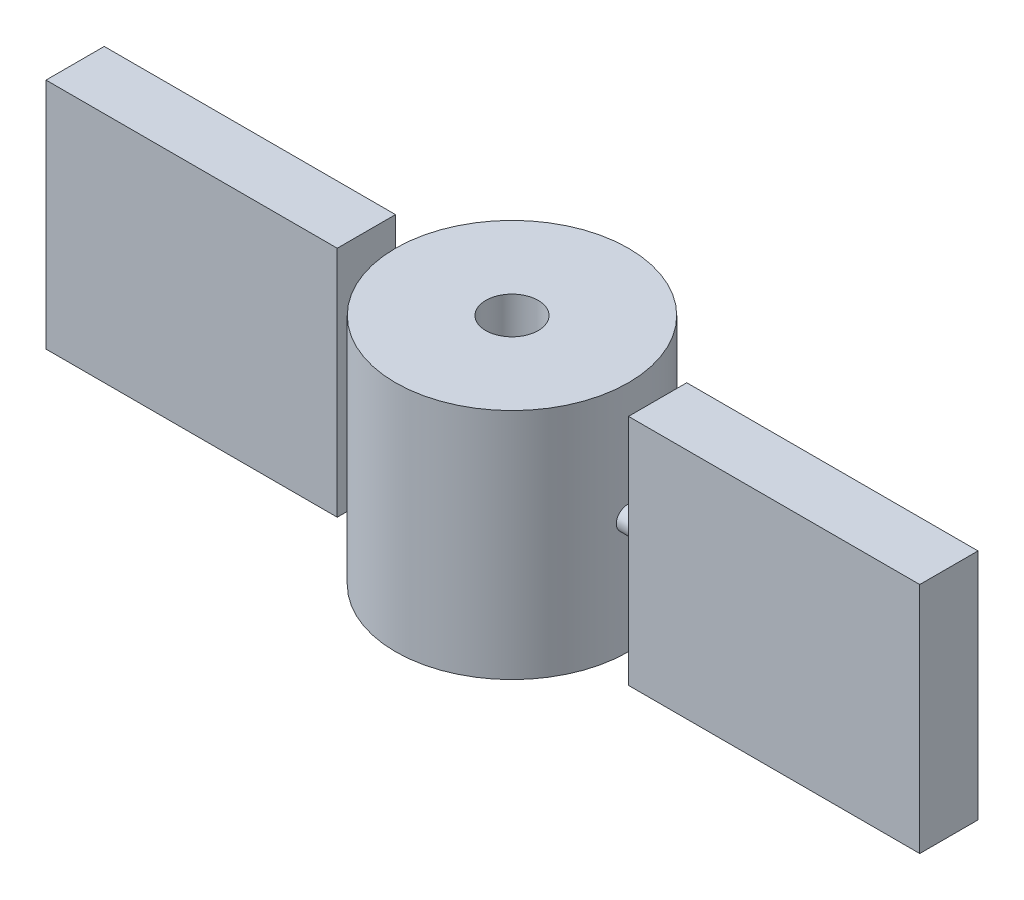
ISO-10303-21;
HEADER;
FILE_DESCRIPTION(('STEP AP214'),'2;1');
FILE_NAME('part.step','',(''),(''),'','','');
FILE_SCHEMA(('AUTOMOTIVE_DESIGN { 1 0 10303 214 1 1 1 1 }'));
ENDSEC;
DATA;
#1=APPLICATION_CONTEXT('core data for automotive mechanical design processes');
#2=APPLICATION_PROTOCOL_DEFINITION('international standard','automotive_design',2000,#1);
#3=PRODUCT_CONTEXT('',#1,'mechanical');
#4=PRODUCT('Part','Part','',(#3));
#5=PRODUCT_RELATED_PRODUCT_CATEGORY('part','',(#4));
#6=PRODUCT_DEFINITION_FORMATION('','',#4);
#7=PRODUCT_DEFINITION_CONTEXT('part definition',#1,'design');
#8=PRODUCT_DEFINITION('design','',#6,#7);
#9=PRODUCT_DEFINITION_SHAPE('','',#8);
#10=(LENGTH_UNIT() NAMED_UNIT(*) SI_UNIT(.MILLI.,.METRE.));
#11=(NAMED_UNIT(*) PLANE_ANGLE_UNIT() SI_UNIT($,.RADIAN.));
#12=(NAMED_UNIT(*) SI_UNIT($,.STERADIAN.) SOLID_ANGLE_UNIT());
#13=UNCERTAINTY_MEASURE_WITH_UNIT(LENGTH_MEASURE(1.E-05),#10,'distance_accuracy_value','');
#14=(GEOMETRIC_REPRESENTATION_CONTEXT(3) GLOBAL_UNCERTAINTY_ASSIGNED_CONTEXT((#13)) GLOBAL_UNIT_ASSIGNED_CONTEXT((#10,
#11,#12)) REPRESENTATION_CONTEXT('',''));
#15=CARTESIAN_POINT('',(0.,0.,0.));
#16=DIRECTION('',(0.,0.,1.));
#17=DIRECTION('',(1.,0.,0.));
#18=AXIS2_PLACEMENT_3D('',#15,#16,#17);
#19=CARTESIAN_POINT('',(50.,20.,0.));
#20=DIRECTION('',(-1.,0.,0.));
#21=DIRECTION('',(0.,0.,1.));
#22=AXIS2_PLACEMENT_3D('',#19,#20,#21);
#23=CYLINDRICAL_SURFACE('',#22,2.);
#24=CARTESIAN_POINT('',(19.8997487421324,20.,1.99999999999999));
#25=CARTESIAN_POINT('',(19.8997500559381,19.8879608716528,1.99999514678702));
#26=CARTESIAN_POINT('',(19.9007051398844,19.7758476631763,1.99055371796494));
#27=CARTESIAN_POINT('',(19.9044217511624,19.5547296274129,1.95303262952712));
#28=CARTESIAN_POINT('',(19.9071852692244,19.445728363925,1.92493242977286));
#29=CARTESIAN_POINT('',(19.9142026609477,19.2340683615642,1.85092023213785));
#30=CARTESIAN_POINT('',(19.9184556309358,19.1314058212171,1.80501903258779));
#31=CARTESIAN_POINT('',(19.9279716114364,18.9352644154165,1.69672853478219));
#32=CARTESIAN_POINT('',(19.9332344212866,18.8417837310325,1.63434251125185));
#33=CARTESIAN_POINT('',(19.944198534198,18.666297472685,1.4946095239974));
#34=CARTESIAN_POINT('',(19.9499012001053,18.5843299809924,1.41721483621652));
#35=CARTESIAN_POINT('',(19.9610901047144,18.4345247819929,1.24976343063912));
#36=CARTESIAN_POINT('',(19.9665763335043,18.3666877211874,1.15970613381313));
#37=CARTESIAN_POINT('',(19.9767276631121,18.2469374859857,0.96925272330197));
#38=CARTESIAN_POINT('',(19.9813910178929,18.1950580024127,0.868835325059134));
#39=CARTESIAN_POINT('',(19.9893563375154,18.1089111337026,0.660659968575017));
#40=CARTESIAN_POINT('',(19.9926583355413,18.074643319261,0.552902189336433));
#41=CARTESIAN_POINT('',(19.9975193314205,18.0248041812935,0.333489565485894));
#42=CARTESIAN_POINT('',(19.9990841568563,18.0091703345001,0.221849054063158));
#43=CARTESIAN_POINT('',(20.0003143119738,17.9968494617326,-0.00248148137789152));
#44=CARTESIAN_POINT('',(19.9999796909055,18.0001619445074,-0.115171478108928));
#45=CARTESIAN_POINT('',(19.9974534262237,18.0255889453003,-0.337977688129126));
#46=CARTESIAN_POINT('',(19.9952684230343,18.0476362311278,-0.448101659869964));
#47=CARTESIAN_POINT('',(19.9892945852986,18.1098022578932,-0.663078359009072));
#48=CARTESIAN_POINT('',(19.9855057299191,18.1499212335751,-0.767931017915463));
#49=CARTESIAN_POINT('',(19.9767387496783,18.2471655265089,-0.969600629359178));
#50=CARTESIAN_POINT('',(19.9717585473152,18.3043205950603,-1.0664031419633));
#51=CARTESIAN_POINT('',(19.9611676903881,18.4339930466727,-1.24906702634839));
#52=CARTESIAN_POINT('',(19.9555570173362,18.5065108802904,-1.33492807712166));
#53=CARTESIAN_POINT('',(19.944305869357,18.6652284590273,-1.49366554364538));
#54=CARTESIAN_POINT('',(19.9386653714606,18.7514866894831,-1.5664834923807));
#55=CARTESIAN_POINT('',(19.9280147985644,18.9350337304215,-1.69661507071584));
#56=CARTESIAN_POINT('',(19.9230047244793,19.0323225569043,-1.75392867782579));
#57=CARTESIAN_POINT('',(19.914181790283,19.2352140503996,-1.85142436914647));
#58=CARTESIAN_POINT('',(19.9103691826511,19.3408184648458,-1.89160284114593));
#59=CARTESIAN_POINT('',(19.9043780374188,19.5573212092294,-1.95364147127519));
#60=CARTESIAN_POINT('',(19.9021994500354,19.6682193777749,-1.97550218748607));
#61=CARTESIAN_POINT('',(19.8997316105483,19.891648359059,-2.00020955078393));
#62=CARTESIAN_POINT('',(19.8994342309521,20.0041700405297,-2.00313799329443));
#63=CARTESIAN_POINT('',(19.9007410270954,20.2281025316457,-1.99011249374273));
#64=CARTESIAN_POINT('',(19.9023451771412,20.3395133562807,-1.97415880681951));
#65=CARTESIAN_POINT('',(19.907266888448,20.5578231645567,-1.92389034901505));
#66=CARTESIAN_POINT('',(19.9105808400269,20.6647311421893,-1.88961425437782));
#67=CARTESIAN_POINT('',(19.9185458207759,20.8712801034606,-1.80371343935189));
#68=CARTESIAN_POINT('',(19.9231968805734,20.9709209205744,-1.75208832156718));
#69=CARTESIAN_POINT('',(19.9333316871143,21.1604799480575,-1.63275000284644));
#70=CARTESIAN_POINT('',(19.9388182162934,21.2503638839325,-1.56498259968139));
#71=CARTESIAN_POINT('',(19.9499966525037,21.4175101065481,-1.41536106690235));
#72=CARTESIAN_POINT('',(19.9556885646173,21.4947720806801,-1.33350658849627));
#73=CARTESIAN_POINT('',(19.966660956986,21.6347632667962,-1.15767960845295));
#74=CARTESIAN_POINT('',(19.9719398811095,21.6974391191724,-1.06366451193891));
#75=CARTESIAN_POINT('',(19.9814688421326,21.8061117370128,-0.866395434834269));
#76=CARTESIAN_POINT('',(19.9857188931298,21.8521087310142,-0.763141580859258));
#77=CARTESIAN_POINT('',(19.9927042082801,21.9260275353107,-0.550512252865638));
#78=CARTESIAN_POINT('',(19.995442172113,21.9539815746504,-0.441148075299926));
#79=CARTESIAN_POINT('',(19.999105892273,21.9911261391597,-0.219249627967365));
#80=CARTESIAN_POINT('',(20.0000316995313,22.0003171916681,-0.106715447384442));
#81=CARTESIAN_POINT('',(19.9999667662654,21.9996674671201,0.117804448151486));
#82=CARTESIAN_POINT('',(19.9989843675334,21.9899095263267,0.229790414449048));
#83=CARTESIAN_POINT('',(19.9952298715518,21.951812508686,0.450523776712718));
#84=CARTESIAN_POINT('',(19.9924577728975,21.9234734172541,0.559271170136724));
#85=CARTESIAN_POINT('',(19.9854344762792,21.8490414852141,0.77043981753548));
#86=CARTESIAN_POINT('',(19.981183480065,21.8029510661317,0.87286193215505));
#87=CARTESIAN_POINT('',(19.9716762483259,21.694333662166,1.06852920030958));
#88=CARTESIAN_POINT('',(19.9664200186831,21.6318067734578,1.16177440753711));
#89=CARTESIAN_POINT('',(19.9554636933811,21.4917807619525,1.33686544885387));
#90=CARTESIAN_POINT('',(19.949761829214,21.4142199675104,1.41866185243867));
#91=CARTESIAN_POINT('',(19.9385718153932,21.2464492969091,1.56811551878628));
#92=CARTESIAN_POINT('',(19.9330837173555,21.1562363896618,1.63576938369569));
#93=CARTESIAN_POINT('',(19.922927668212,20.9654713161602,1.7551532808481));
#94=CARTESIAN_POINT('',(19.9182618385061,20.8648934373519,1.80684237598966));
#95=CARTESIAN_POINT('',(19.9103038952492,20.6565034175075,1.89252941619753));
#96=CARTESIAN_POINT('',(19.9070102330672,20.5486995921486,1.92654731577971));
#97=CARTESIAN_POINT('',(19.9030001507629,20.3669045182018,1.96744337666705));
#98=CARTESIAN_POINT('',(19.9017866387139,20.2940754973871,1.97963542479644));
#99=CARTESIAN_POINT('',(19.9001605035533,20.1475083539149,1.99591531721022));
#100=CARTESIAN_POINT('',(19.8997478770797,20.0737702350748,2.00000319551452));
#101=CARTESIAN_POINT('',(19.8997487421324,20.,1.99999999999999));
#102=B_SPLINE_CURVE_WITH_KNOTS('',3,(#24,#25,#26,#27,#28,#29,#30,#31,#32,#33,#34,#35,#36,#37,
#38,#39,#40,#41,#42,#43,#44,#45,#46,#47,#48,#49,#50,#51,#52,#53,#54,#55,#56,#57,#58,#59,#60,#61,
#62,#63,#64,#65,#66,#67,#68,#69,#70,#71,#72,#73,#74,#75,#76,#77,#78,#79,#80,#81,#82,#83,#84,#85,
#86,#87,#88,#89,#90,#91,#92,#93,#94,#95,#96,#97,#98,#99,#100,#101),.UNSPECIFIED.,.T.,.F.,(4,2,2,
2,2,2,2,2,2,2,2,2,2,2,2,2,2,2,2,2,2,2,2,2,2,2,2,2,2,2,2,2,2,2,2,2,2,2,4),(0.,0.335847988872923,
0.672066303643539,1.00808098199495,1.34402896084263,1.6810632305985,2.01811291710506,
2.35586939942583,2.69361764815589,3.03022941796899,3.36683245996465,3.70223263637323,
4.03763716961949,4.37363090932827,4.70963450437058,5.04710850170003,5.38458298855126,
5.72212858235868,6.05966389190066,6.3957399261553,6.7318114193374,7.06717629409054,
7.40254885122095,7.73906379623436,8.07558707446405,8.41332273636237,8.7510537703601,
9.08817985388722,9.42529646226299,9.76094266936966,10.0965891399332,10.4321898399049,
10.767788576216,11.1047943007598,11.4418809006905,11.7798248214095,12.11738629788,
12.3385205521209,12.5596538780763),.UNSPECIFIED.);
#103=CARTESIAN_POINT('',(19.8997487421324,20.,1.99999999999999));
#104=VERTEX_POINT('',#103);
#105=EDGE_CURVE('E52',#104,#104,#102,.T.);
#106=ORIENTED_EDGE('',*,*,#105,.T.);
#107=EDGE_LOOP('',(#106));
#108=FACE_BOUND('',#107,.T.);
#109=CARTESIAN_POINT('',(25.,20.,0.));
#110=DIRECTION('',(1.,0.,0.));
#111=DIRECTION('',(0.,0.,-1.));
#112=AXIS2_PLACEMENT_3D('',#109,#110,#111);
#113=CIRCLE('',#112,2.);
#114=CARTESIAN_POINT('',(25.,20.,-2.00000000000001));
#115=VERTEX_POINT('',#114);
#116=EDGE_CURVE('E11',#115,#115,#113,.T.);
#117=ORIENTED_EDGE('',*,*,#116,.F.);
#118=EDGE_LOOP('',(#117));
#119=FACE_BOUND('',#118,.T.);
#120=ADVANCED_FACE('F41',(#108,#119),#23,.T.);
#121=CARTESIAN_POINT('',(0.,40.,0.));
#122=DIRECTION('',(0.,-1.,0.));
#123=DIRECTION('',(0.,0.,-1.));
#124=AXIS2_PLACEMENT_3D('',#121,#122,#123);
#125=CYLINDRICAL_SURFACE('',#124,20.);
#126=CARTESIAN_POINT('',(0.,40.,0.));
#127=DIRECTION('',(0.,1.,0.));
#128=DIRECTION('',(0.,0.,1.));
#129=AXIS2_PLACEMENT_3D('',#126,#127,#128);
#130=CIRCLE('',#129,20.);
#131=CARTESIAN_POINT('',(0.,40.,20.));
#132=VERTEX_POINT('',#131);
#133=EDGE_CURVE('E183',#132,#132,#130,.T.);
#134=ORIENTED_EDGE('',*,*,#133,.F.);
#135=EDGE_LOOP('',(#134));
#136=FACE_BOUND('',#135,.T.);
#137=CARTESIAN_POINT('',(0.,0.,0.));
#138=DIRECTION('',(0.,1.,0.));
#139=DIRECTION('',(0.,0.,1.));
#140=AXIS2_PLACEMENT_3D('',#137,#138,#139);
#141=CIRCLE('',#140,20.);
#142=CARTESIAN_POINT('',(0.,0.,20.));
#143=VERTEX_POINT('',#142);
#144=EDGE_CURVE('E187',#143,#143,#141,.T.);
#145=ORIENTED_EDGE('',*,*,#144,.T.);
#146=EDGE_LOOP('',(#145));
#147=FACE_BOUND('',#146,.T.);
#148=CARTESIAN_POINT('',(-19.8997487421324,20.,1.99999999999999));
#149=CARTESIAN_POINT('',(-19.8997500559381,20.1120391283472,1.99999514678702));
#150=CARTESIAN_POINT('',(-19.9007051398844,20.2241523368237,1.99055371796494));
#151=CARTESIAN_POINT('',(-19.9044217511624,20.4452703725871,1.95303262952712));
#152=CARTESIAN_POINT('',(-19.9071852692244,20.554271636075,1.92493242977287));
#153=CARTESIAN_POINT('',(-19.9142026609477,20.7659316384358,1.85092023213785));
#154=CARTESIAN_POINT('',(-19.9184556309358,20.8685941787829,1.80501903258779));
#155=CARTESIAN_POINT('',(-19.9279716114364,21.0647355845835,1.6967285347822));
#156=CARTESIAN_POINT('',(-19.9332344212866,21.1582162689674,1.63434251125185));
#157=CARTESIAN_POINT('',(-19.944198534198,21.333702527315,1.4946095239974));
#158=CARTESIAN_POINT('',(-19.9499012001053,21.4156700190075,1.41721483621652));
#159=CARTESIAN_POINT('',(-19.9610901047144,21.5654752180071,1.24976343063912));
#160=CARTESIAN_POINT('',(-19.9665763335043,21.6333122788126,1.15970613381313));
#161=CARTESIAN_POINT('',(-19.9767276631121,21.7530625140143,0.96925272330197));
#162=CARTESIAN_POINT('',(-19.9813910178929,21.8049419975873,0.868835325059134));
#163=CARTESIAN_POINT('',(-19.9893563375154,21.8910888662974,0.660659968575017));
#164=CARTESIAN_POINT('',(-19.9926583355413,21.9253566807389,0.552902189336433));
#165=CARTESIAN_POINT('',(-19.9975193314205,21.9751958187065,0.333489565485894));
#166=CARTESIAN_POINT('',(-19.9990841568563,21.9908296654999,0.221849054063158));
#167=CARTESIAN_POINT('',(-20.0003143119738,22.0031505382674,-0.00248148137789152));
#168=CARTESIAN_POINT('',(-19.9999796909055,21.9998380554925,-0.115171478108928));
#169=CARTESIAN_POINT('',(-19.9974534262237,21.9744110546997,-0.337977688129126));
#170=CARTESIAN_POINT('',(-19.9952684230343,21.9523637688722,-0.448101659869964));
#171=CARTESIAN_POINT('',(-19.9892945852986,21.8901977421067,-0.663078359009072));
#172=CARTESIAN_POINT('',(-19.9855057299191,21.8500787664248,-0.767931017915463));
#173=CARTESIAN_POINT('',(-19.9767387496783,21.7528344734911,-0.969600629359178));
#174=CARTESIAN_POINT('',(-19.9717585473152,21.6956794049397,-1.0664031419633));
#175=CARTESIAN_POINT('',(-19.9611676903881,21.5660069533272,-1.24906702634839));
#176=CARTESIAN_POINT('',(-19.9555570173362,21.4934891197096,-1.33492807712166));
#177=CARTESIAN_POINT('',(-19.944305869357,21.3347715409727,-1.49366554364538));
#178=CARTESIAN_POINT('',(-19.9386653714606,21.2485133105168,-1.5664834923807));
#179=CARTESIAN_POINT('',(-19.9280147985644,21.0649662695784,-1.69661507071584));
#180=CARTESIAN_POINT('',(-19.9230047244793,20.9676774430957,-1.75392867782579));
#181=CARTESIAN_POINT('',(-19.914181790283,20.7647859496004,-1.85142436914647));
#182=CARTESIAN_POINT('',(-19.9103691826511,20.6591815351542,-1.89160284114593));
#183=CARTESIAN_POINT('',(-19.9043780374188,20.4426787907706,-1.95364147127518));
#184=CARTESIAN_POINT('',(-19.9021994500354,20.3317806222251,-1.97550218748607));
#185=CARTESIAN_POINT('',(-19.8997316105483,20.108351640941,-2.00020955078393));
#186=CARTESIAN_POINT('',(-19.8994342309521,19.9958299594703,-2.00313799329443));
#187=CARTESIAN_POINT('',(-19.9007410270954,19.7718974683543,-1.99011249374273));
#188=CARTESIAN_POINT('',(-19.9023451771412,19.6604866437193,-1.97415880681951));
#189=CARTESIAN_POINT('',(-19.907266888448,19.4421768354433,-1.92389034901505));
#190=CARTESIAN_POINT('',(-19.9105808400269,19.3352688578107,-1.88961425437782));
#191=CARTESIAN_POINT('',(-19.9185458207759,19.1287198965394,-1.80371343935189));
#192=CARTESIAN_POINT('',(-19.9231968805734,19.0290790794256,-1.75208832156718));
#193=CARTESIAN_POINT('',(-19.9333316871143,18.8395200519424,-1.63275000284644));
#194=CARTESIAN_POINT('',(-19.9388182162934,18.7496361160675,-1.56498259968139));
#195=CARTESIAN_POINT('',(-19.9499966525037,18.5824898934519,-1.41536106690235));
#196=CARTESIAN_POINT('',(-19.9556885646173,18.5052279193198,-1.33350658849627));
#197=CARTESIAN_POINT('',(-19.966660956986,18.3652367332038,-1.15767960845295));
#198=CARTESIAN_POINT('',(-19.9719398811095,18.3025608808275,-1.06366451193891));
#199=CARTESIAN_POINT('',(-19.9814688421326,18.1938882629872,-0.866395434834272));
#200=CARTESIAN_POINT('',(-19.9857188931298,18.1478912689858,-0.76314158085926));
#201=CARTESIAN_POINT('',(-19.9927042082801,18.0739724646893,-0.550512252865637));
#202=CARTESIAN_POINT('',(-19.995442172113,18.0460184253496,-0.441148075299926));
#203=CARTESIAN_POINT('',(-19.999105892273,18.0088738608403,-0.219249627967365));
#204=CARTESIAN_POINT('',(-20.0000316995313,17.9996828083319,-0.106715447384442));
#205=CARTESIAN_POINT('',(-19.9999667662654,18.0003325328799,0.117804448151487));
#206=CARTESIAN_POINT('',(-19.9989843675334,18.0100904736733,0.229790414449049));
#207=CARTESIAN_POINT('',(-19.9952298715518,18.0481874913139,0.450523776712719));
#208=CARTESIAN_POINT('',(-19.9924577728975,18.0765265827459,0.559271170136725));
#209=CARTESIAN_POINT('',(-19.9854344762792,18.1509585147859,0.77043981753548));
#210=CARTESIAN_POINT('',(-19.981183480065,18.1970489338683,0.87286193215505));
#211=CARTESIAN_POINT('',(-19.9716762483259,18.3056663378339,1.06852920030958));
#212=CARTESIAN_POINT('',(-19.9664200186831,18.3681932265422,1.16177440753711));
#213=CARTESIAN_POINT('',(-19.9554636933811,18.5082192380475,1.33686544885387));
#214=CARTESIAN_POINT('',(-19.949761829214,18.5857800324896,1.41866185243868));
#215=CARTESIAN_POINT('',(-19.9385718153932,18.7535507030909,1.56811551878628));
#216=CARTESIAN_POINT('',(-19.9330837173555,18.8437636103381,1.63576938369569));
#217=CARTESIAN_POINT('',(-19.922927668212,19.0345286838398,1.7551532808481));
#218=CARTESIAN_POINT('',(-19.9182618385061,19.1351065626481,1.80684237598966));
#219=CARTESIAN_POINT('',(-19.9103038952492,19.3434965824925,1.89252941619753));
#220=CARTESIAN_POINT('',(-19.9070102330672,19.4513004078514,1.92654731577971));
#221=CARTESIAN_POINT('',(-19.9030001507629,19.6330954817982,1.96744337666705));
#222=CARTESIAN_POINT('',(-19.9017866387139,19.7059245026128,1.97963542479644));
#223=CARTESIAN_POINT('',(-19.9001605035533,19.8524916460851,1.99591531721022));
#224=CARTESIAN_POINT('',(-19.8997478770797,19.9262297649252,2.00000319551452));
#225=CARTESIAN_POINT('',(-19.8997487421324,20.,1.99999999999999));
#226=B_SPLINE_CURVE_WITH_KNOTS('',3,(#148,#149,#150,#151,#152,#153,#154,#155,#156,#157,#158,
#159,#160,#161,#162,#163,#164,#165,#166,#167,#168,#169,#170,#171,#172,#173,#174,#175,#176,#177,
#178,#179,#180,#181,#182,#183,#184,#185,#186,#187,#188,#189,#190,#191,#192,#193,#194,#195,#196,
#197,#198,#199,#200,#201,#202,#203,#204,#205,#206,#207,#208,#209,#210,#211,#212,#213,#214,#215,
#216,#217,#218,#219,#220,#221,#222,#223,#224,#225),.UNSPECIFIED.,.T.,.F.,(4,2,2,2,2,2,2,2,2,2,2,
2,2,2,2,2,2,2,2,2,2,2,2,2,2,2,2,2,2,2,2,2,2,2,2,2,2,2,4),(0.,0.335847988872923,
0.672066303643539,1.00808098199494,1.34402896084263,1.6810632305985,2.01811291710506,
2.35586939942583,2.69361764815589,3.03022941796899,3.36683245996465,3.70223263637323,
4.03763716961949,4.37363090932827,4.70963450437058,5.04710850170003,5.38458298855126,
5.72212858235867,6.05966389190066,6.39573992615531,6.73181141933741,7.06717629409054,
7.40254885122095,7.73906379623436,8.07558707446405,8.41332273636236,8.7510537703601,
9.08817985388723,9.42529646226299,9.76094266936967,10.0965891399332,10.4321898399049,
10.767788576216,11.1047943007598,11.4418809006905,11.7798248214095,12.11738629788,
12.3385205521209,12.5596538780763),.UNSPECIFIED.);
#227=CARTESIAN_POINT('',(-19.8997487421324,20.,1.99999999999999));
#228=VERTEX_POINT('',#227);
#229=EDGE_CURVE('E186',#228,#228,#226,.T.);
#230=ORIENTED_EDGE('',*,*,#229,.F.);
#231=EDGE_LOOP('',(#230));
#232=FACE_BOUND('',#231,.T.);
#233=ORIENTED_EDGE('',*,*,#105,.F.);
#234=EDGE_LOOP('',(#233));
#235=FACE_BOUND('',#234,.T.);
#236=ADVANCED_FACE('F43',(#136,#147,#232,#235),#125,.T.);
#237=CARTESIAN_POINT('',(0.,40.,0.));
#238=DIRECTION('',(0.,1.,0.));
#239=DIRECTION('',(0.,0.,1.));
#240=AXIS2_PLACEMENT_3D('',#237,#238,#239);
#241=PLANE('',#240);
#242=CARTESIAN_POINT('',(0.,40.,0.));
#243=DIRECTION('',(0.,1.,0.));
#244=DIRECTION('',(0.,0.,1.));
#245=AXIS2_PLACEMENT_3D('',#242,#243,#244);
#246=CIRCLE('',#245,4.5);
#247=CARTESIAN_POINT('',(0.,40.,4.5));
#248=VERTEX_POINT('',#247);
#249=EDGE_CURVE('E404',#248,#248,#246,.T.);
#250=ORIENTED_EDGE('',*,*,#249,.F.);
#251=EDGE_LOOP('',(#250));
#252=FACE_BOUND('',#251,.T.);
#253=ORIENTED_EDGE('',*,*,#133,.T.);
#254=EDGE_LOOP('',(#253));
#255=FACE_BOUND('',#254,.T.);
#256=ADVANCED_FACE('F208',(#252,#255),#241,.T.);
#257=CARTESIAN_POINT('',(0.,0.,0.));
#258=DIRECTION('',(0.,1.,0.));
#259=DIRECTION('',(0.,0.,1.));
#260=AXIS2_PLACEMENT_3D('',#257,#258,#259);
#261=PLANE('',#260);
#262=CARTESIAN_POINT('',(0.,0.,0.));
#263=DIRECTION('',(0.,1.,0.));
#264=DIRECTION('',(0.,0.,1.));
#265=AXIS2_PLACEMENT_3D('',#262,#263,#264);
#266=CIRCLE('',#265,2.15);
#267=CARTESIAN_POINT('',(0.,0.,2.15));
#268=VERTEX_POINT('',#267);
#269=EDGE_CURVE('E224',#268,#268,#266,.T.);
#270=ORIENTED_EDGE('',*,*,#269,.T.);
#271=EDGE_LOOP('',(#270));
#272=FACE_BOUND('',#271,.T.);
#273=ORIENTED_EDGE('',*,*,#144,.F.);
#274=EDGE_LOOP('',(#273));
#275=FACE_BOUND('',#274,.T.);
#276=ADVANCED_FACE('F211',(#272,#275),#261,.F.);
#277=CARTESIAN_POINT('',(-25.,20.,0.));
#278=DIRECTION('',(1.,0.,0.));
#279=DIRECTION('',(0.,1.,0.));
#280=AXIS2_PLACEMENT_3D('',#277,#278,#279);
#281=CIRCLE('',#280,2.);
#282=CARTESIAN_POINT('',(-25.,22.,0.));
#283=VERTEX_POINT('',#282);
#284=EDGE_CURVE('E182',#283,#283,#281,.T.);
#285=ORIENTED_EDGE('',*,*,#284,.T.);
#286=EDGE_LOOP('',(#285));
#287=FACE_BOUND('',#286,.T.);
#288=ORIENTED_EDGE('',*,*,#229,.T.);
#289=EDGE_LOOP('',(#288));
#290=FACE_BOUND('',#289,.T.);
#291=ADVANCED_FACE('F205',(#287,#290),#23,.T.);
#292=CARTESIAN_POINT('',(-25.,0.,5.));
#293=DIRECTION('',(1.,0.,0.));
#294=DIRECTION('',(0.,1.,0.));
#295=AXIS2_PLACEMENT_3D('',#292,#293,#294);
#296=PLANE('',#295);
#297=ORIENTED_EDGE('',*,*,#284,.F.);
#298=EDGE_LOOP('',(#297));
#299=FACE_BOUND('',#298,.T.);
#300=DIRECTION('',(0.,-1.,0.));
#301=VECTOR('',#300,1.);
#302=CARTESIAN_POINT('',(-25.,0.,-5.));
#303=LINE('',#302,#301);
#304=CARTESIAN_POINT('',(-25.,40.,-5.));
#305=VERTEX_POINT('',#304);
#306=CARTESIAN_POINT('',(-25.,0.,-5.));
#307=VERTEX_POINT('',#306);
#308=EDGE_CURVE('E126',#305,#307,#303,.T.);
#309=ORIENTED_EDGE('',*,*,#308,.F.);
#310=DIRECTION('',(0.,0.,-1.));
#311=VECTOR('',#310,1.);
#312=CARTESIAN_POINT('',(-25.,40.,5.));
#313=LINE('',#312,#311);
#314=CARTESIAN_POINT('',(-25.,40.,5.));
#315=VERTEX_POINT('',#314);
#316=EDGE_CURVE('E88',#315,#305,#313,.T.);
#317=ORIENTED_EDGE('',*,*,#316,.F.);
#318=DIRECTION('',(0.,-1.,0.));
#319=VECTOR('',#318,1.);
#320=CARTESIAN_POINT('',(-25.,0.,5.));
#321=LINE('',#320,#319);
#322=CARTESIAN_POINT('',(-25.,0.,5.));
#323=VERTEX_POINT('',#322);
#324=EDGE_CURVE('E160',#315,#323,#321,.T.);
#325=ORIENTED_EDGE('',*,*,#324,.T.);
#326=DIRECTION('',(0.,0.,-1.));
#327=VECTOR('',#326,1.);
#328=CARTESIAN_POINT('',(-25.,0.,5.));
#329=LINE('',#328,#327);
#330=EDGE_CURVE('E84',#323,#307,#329,.T.);
#331=ORIENTED_EDGE('',*,*,#330,.T.);
#332=EDGE_LOOP('',(#309,#317,#325,#331));
#333=FACE_BOUND('',#332,.T.);
#334=ADVANCED_FACE('F206',(#299,#333),#296,.T.);
#335=CARTESIAN_POINT('',(0.,40.,5.));
#336=DIRECTION('',(0.,1.,0.));
#337=DIRECTION('',(0.,0.,1.));
#338=AXIS2_PLACEMENT_3D('',#335,#336,#337);
#339=PLANE('',#338);
#340=DIRECTION('',(1.,0.,0.));
#341=VECTOR('',#340,1.);
#342=CARTESIAN_POINT('',(0.,40.,-5.));
#343=LINE('',#342,#341);
#344=CARTESIAN_POINT('',(-75.,40.,-5.));
#345=VERTEX_POINT('',#344);
#346=EDGE_CURVE('E171',#345,#305,#343,.T.);
#347=ORIENTED_EDGE('',*,*,#346,.F.);
#348=DIRECTION('',(0.,0.,-1.));
#349=VECTOR('',#348,1.);
#350=CARTESIAN_POINT('',(-75.,40.,5.));
#351=LINE('',#350,#349);
#352=CARTESIAN_POINT('',(-75.,40.,5.));
#353=VERTEX_POINT('',#352);
#354=EDGE_CURVE('E179',#353,#345,#351,.T.);
#355=ORIENTED_EDGE('',*,*,#354,.F.);
#356=DIRECTION('',(1.,0.,0.));
#357=VECTOR('',#356,1.);
#358=CARTESIAN_POINT('',(0.,40.,5.));
#359=LINE('',#358,#357);
#360=EDGE_CURVE('E162',#353,#315,#359,.T.);
#361=ORIENTED_EDGE('',*,*,#360,.T.);
#362=ORIENTED_EDGE('',*,*,#316,.T.);
#363=EDGE_LOOP('',(#347,#355,#361,#362));
#364=FACE_BOUND('',#363,.T.);
#365=ADVANCED_FACE('F278',(#364),#339,.T.);
#366=CARTESIAN_POINT('',(-75.,0.,5.));
#367=DIRECTION('',(1.,0.,0.));
#368=DIRECTION('',(0.,1.,0.));
#369=AXIS2_PLACEMENT_3D('',#366,#367,#368);
#370=PLANE('',#369);
#371=DIRECTION('',(0.,-1.,0.));
#372=VECTOR('',#371,1.);
#373=CARTESIAN_POINT('',(-75.,0.,-5.));
#374=LINE('',#373,#372);
#375=CARTESIAN_POINT('',(-75.,0.,-5.));
#376=VERTEX_POINT('',#375);
#377=EDGE_CURVE('E77',#345,#376,#374,.T.);
#378=ORIENTED_EDGE('',*,*,#377,.T.);
#379=DIRECTION('',(0.,0.,-1.));
#380=VECTOR('',#379,1.);
#381=CARTESIAN_POINT('',(-75.,0.,5.));
#382=LINE('',#381,#380);
#383=CARTESIAN_POINT('',(-75.,0.,5.));
#384=VERTEX_POINT('',#383);
#385=EDGE_CURVE('E177',#384,#376,#382,.T.);
#386=ORIENTED_EDGE('',*,*,#385,.F.);
#387=DIRECTION('',(0.,-1.,0.));
#388=VECTOR('',#387,1.);
#389=CARTESIAN_POINT('',(-75.,0.,5.));
#390=LINE('',#389,#388);
#391=EDGE_CURVE('E166',#353,#384,#390,.T.);
#392=ORIENTED_EDGE('',*,*,#391,.F.);
#393=ORIENTED_EDGE('',*,*,#354,.T.);
#394=EDGE_LOOP('',(#378,#386,#392,#393));
#395=FACE_BOUND('',#394,.T.);
#396=ADVANCED_FACE('F275',(#395),#370,.F.);
#397=CARTESIAN_POINT('',(0.,0.,5.));
#398=DIRECTION('',(0.,1.,0.));
#399=DIRECTION('',(0.,0.,1.));
#400=AXIS2_PLACEMENT_3D('',#397,#398,#399);
#401=PLANE('',#400);
#402=DIRECTION('',(1.,0.,0.));
#403=VECTOR('',#402,1.);
#404=CARTESIAN_POINT('',(0.,0.,-5.));
#405=LINE('',#404,#403);
#406=EDGE_CURVE('E163',#376,#307,#405,.T.);
#407=ORIENTED_EDGE('',*,*,#406,.T.);
#408=ORIENTED_EDGE('',*,*,#330,.F.);
#409=DIRECTION('',(1.,0.,0.));
#410=VECTOR('',#409,1.);
#411=CARTESIAN_POINT('',(0.,0.,5.));
#412=LINE('',#411,#410);
#413=EDGE_CURVE('E60',#384,#323,#412,.T.);
#414=ORIENTED_EDGE('',*,*,#413,.F.);
#415=ORIENTED_EDGE('',*,*,#385,.T.);
#416=EDGE_LOOP('',(#407,#408,#414,#415));
#417=FACE_BOUND('',#416,.T.);
#418=ADVANCED_FACE('F269',(#417),#401,.F.);
#419=CARTESIAN_POINT('',(0.,0.,5.));
#420=DIRECTION('',(0.,0.,1.));
#421=DIRECTION('',(1.,0.,0.));
#422=AXIS2_PLACEMENT_3D('',#419,#420,#421);
#423=PLANE('',#422);
#424=ORIENTED_EDGE('',*,*,#324,.F.);
#425=ORIENTED_EDGE('',*,*,#360,.F.);
#426=ORIENTED_EDGE('',*,*,#391,.T.);
#427=ORIENTED_EDGE('',*,*,#413,.T.);
#428=EDGE_LOOP('',(#424,#425,#426,#427));
#429=FACE_BOUND('',#428,.T.);
#430=ADVANCED_FACE('F266',(#429),#423,.T.);
#431=CARTESIAN_POINT('',(0.,0.,-5.));
#432=DIRECTION('',(0.,0.,1.));
#433=DIRECTION('',(1.,0.,0.));
#434=AXIS2_PLACEMENT_3D('',#431,#432,#433);
#435=PLANE('',#434);
#436=ORIENTED_EDGE('',*,*,#308,.T.);
#437=ORIENTED_EDGE('',*,*,#406,.F.);
#438=ORIENTED_EDGE('',*,*,#377,.F.);
#439=ORIENTED_EDGE('',*,*,#346,.T.);
#440=EDGE_LOOP('',(#436,#437,#438,#439));
#441=FACE_BOUND('',#440,.T.);
#442=ADVANCED_FACE('F265',(#441),#435,.F.);
#443=CARTESIAN_POINT('',(75.,0.,5.));
#444=DIRECTION('',(1.,0.,0.));
#445=DIRECTION('',(0.,0.,-1.));
#446=AXIS2_PLACEMENT_3D('',#443,#444,#445);
#447=PLANE('',#446);
#448=DIRECTION('',(0.,-1.,0.));
#449=VECTOR('',#448,1.);
#450=CARTESIAN_POINT('',(75.,0.,-5.));
#451=LINE('',#450,#449);
#452=CARTESIAN_POINT('',(75.,40.,-5.));
#453=VERTEX_POINT('',#452);
#454=CARTESIAN_POINT('',(75.,0.,-5.));
#455=VERTEX_POINT('',#454);
#456=EDGE_CURVE('E121',#453,#455,#451,.T.);
#457=ORIENTED_EDGE('',*,*,#456,.F.);
#458=DIRECTION('',(0.,0.,-1.));
#459=VECTOR('',#458,1.);
#460=CARTESIAN_POINT('',(75.,40.,5.));
#461=LINE('',#460,#459);
#462=CARTESIAN_POINT('',(75.,40.,5.));
#463=VERTEX_POINT('',#462);
#464=EDGE_CURVE('E116',#463,#453,#461,.T.);
#465=ORIENTED_EDGE('',*,*,#464,.F.);
#466=DIRECTION('',(0.,-1.,0.));
#467=VECTOR('',#466,1.);
#468=CARTESIAN_POINT('',(75.,0.,5.));
#469=LINE('',#468,#467);
#470=CARTESIAN_POINT('',(75.,0.,5.));
#471=VERTEX_POINT('',#470);
#472=EDGE_CURVE('E119',#463,#471,#469,.T.);
#473=ORIENTED_EDGE('',*,*,#472,.T.);
#474=DIRECTION('',(0.,0.,-1.));
#475=VECTOR('',#474,1.);
#476=CARTESIAN_POINT('',(75.,0.,5.));
#477=LINE('',#476,#475);
#478=EDGE_CURVE('E146',#471,#455,#477,.T.);
#479=ORIENTED_EDGE('',*,*,#478,.T.);
#480=EDGE_LOOP('',(#457,#465,#473,#479));
#481=FACE_BOUND('',#480,.T.);
#482=ADVANCED_FACE('F118',(#481),#447,.T.);
#483=CARTESIAN_POINT('',(0.,40.,5.));
#484=DIRECTION('',(0.,1.,0.));
#485=DIRECTION('',(0.,0.,1.));
#486=AXIS2_PLACEMENT_3D('',#483,#484,#485);
#487=PLANE('',#486);
#488=DIRECTION('',(1.,0.,0.));
#489=VECTOR('',#488,1.);
#490=CARTESIAN_POINT('',(0.,40.,-5.));
#491=LINE('',#490,#489);
#492=CARTESIAN_POINT('',(25.,40.,-5.));
#493=VERTEX_POINT('',#492);
#494=EDGE_CURVE('E148',#493,#453,#491,.T.);
#495=ORIENTED_EDGE('',*,*,#494,.F.);
#496=DIRECTION('',(0.,0.,-1.));
#497=VECTOR('',#496,1.);
#498=CARTESIAN_POINT('',(25.,40.,5.));
#499=LINE('',#498,#497);
#500=CARTESIAN_POINT('',(25.,40.,5.));
#501=VERTEX_POINT('',#500);
#502=EDGE_CURVE('E127',#501,#493,#499,.T.);
#503=ORIENTED_EDGE('',*,*,#502,.F.);
#504=DIRECTION('',(1.,0.,0.));
#505=VECTOR('',#504,1.);
#506=CARTESIAN_POINT('',(0.,40.,5.));
#507=LINE('',#506,#505);
#508=EDGE_CURVE('E132',#501,#463,#507,.T.);
#509=ORIENTED_EDGE('',*,*,#508,.T.);
#510=ORIENTED_EDGE('',*,*,#464,.T.);
#511=EDGE_LOOP('',(#495,#503,#509,#510));
#512=FACE_BOUND('',#511,.T.);
#513=ADVANCED_FACE('F138',(#512),#487,.T.);
#514=CARTESIAN_POINT('',(25.,0.,5.));
#515=DIRECTION('',(1.,0.,0.));
#516=DIRECTION('',(0.,0.,-1.));
#517=AXIS2_PLACEMENT_3D('',#514,#515,#516);
#518=PLANE('',#517);
#519=ORIENTED_EDGE('',*,*,#116,.T.);
#520=EDGE_LOOP('',(#519));
#521=FACE_BOUND('',#520,.T.);
#522=DIRECTION('',(0.,-1.,0.));
#523=VECTOR('',#522,1.);
#524=CARTESIAN_POINT('',(25.,0.,-5.));
#525=LINE('',#524,#523);
#526=CARTESIAN_POINT('',(25.,0.,-5.));
#527=VERTEX_POINT('',#526);
#528=EDGE_CURVE('E151',#493,#527,#525,.T.);
#529=ORIENTED_EDGE('',*,*,#528,.T.);
#530=DIRECTION('',(0.,0.,-1.));
#531=VECTOR('',#530,1.);
#532=CARTESIAN_POINT('',(25.,0.,5.));
#533=LINE('',#532,#531);
#534=CARTESIAN_POINT('',(25.,0.,5.));
#535=VERTEX_POINT('',#534);
#536=EDGE_CURVE('E156',#535,#527,#533,.T.);
#537=ORIENTED_EDGE('',*,*,#536,.F.);
#538=DIRECTION('',(0.,-1.,0.));
#539=VECTOR('',#538,1.);
#540=CARTESIAN_POINT('',(25.,0.,5.));
#541=LINE('',#540,#539);
#542=EDGE_CURVE('E140',#501,#535,#541,.T.);
#543=ORIENTED_EDGE('',*,*,#542,.F.);
#544=ORIENTED_EDGE('',*,*,#502,.T.);
#545=EDGE_LOOP('',(#529,#537,#543,#544));
#546=FACE_BOUND('',#545,.T.);
#547=ADVANCED_FACE('F237',(#521,#546),#518,.F.);
#548=CARTESIAN_POINT('',(0.,0.,5.));
#549=DIRECTION('',(0.,1.,0.));
#550=DIRECTION('',(0.,0.,1.));
#551=AXIS2_PLACEMENT_3D('',#548,#549,#550);
#552=PLANE('',#551);
#553=DIRECTION('',(1.,0.,0.));
#554=VECTOR('',#553,1.);
#555=CARTESIAN_POINT('',(0.,0.,-5.));
#556=LINE('',#555,#554);
#557=EDGE_CURVE('E136',#527,#455,#556,.T.);
#558=ORIENTED_EDGE('',*,*,#557,.T.);
#559=ORIENTED_EDGE('',*,*,#478,.F.);
#560=DIRECTION('',(1.,0.,0.));
#561=VECTOR('',#560,1.);
#562=CARTESIAN_POINT('',(0.,0.,5.));
#563=LINE('',#562,#561);
#564=EDGE_CURVE('E134',#535,#471,#563,.T.);
#565=ORIENTED_EDGE('',*,*,#564,.F.);
#566=ORIENTED_EDGE('',*,*,#536,.T.);
#567=EDGE_LOOP('',(#558,#559,#565,#566));
#568=FACE_BOUND('',#567,.T.);
#569=ADVANCED_FACE('F240',(#568),#552,.F.);
#570=CARTESIAN_POINT('',(0.,0.,5.));
#571=DIRECTION('',(0.,0.,1.));
#572=DIRECTION('',(1.,0.,0.));
#573=AXIS2_PLACEMENT_3D('',#570,#571,#572);
#574=PLANE('',#573);
#575=ORIENTED_EDGE('',*,*,#472,.F.);
#576=ORIENTED_EDGE('',*,*,#508,.F.);
#577=ORIENTED_EDGE('',*,*,#542,.T.);
#578=ORIENTED_EDGE('',*,*,#564,.T.);
#579=EDGE_LOOP('',(#575,#576,#577,#578));
#580=FACE_BOUND('',#579,.T.);
#581=ADVANCED_FACE('F131',(#580),#574,.T.);
#582=CARTESIAN_POINT('',(0.,0.,-5.));
#583=DIRECTION('',(0.,0.,1.));
#584=DIRECTION('',(1.,0.,0.));
#585=AXIS2_PLACEMENT_3D('',#582,#583,#584);
#586=PLANE('',#585);
#587=ORIENTED_EDGE('',*,*,#456,.T.);
#588=ORIENTED_EDGE('',*,*,#557,.F.);
#589=ORIENTED_EDGE('',*,*,#528,.F.);
#590=ORIENTED_EDGE('',*,*,#494,.T.);
#591=EDGE_LOOP('',(#587,#588,#589,#590));
#592=FACE_BOUND('',#591,.T.);
#593=ADVANCED_FACE('F247',(#592),#586,.F.);
#594=CARTESIAN_POINT('',(0.,9.99999999999999,0.));
#595=DIRECTION('',(0.,1.,0.));
#596=DIRECTION('',(0.,0.,1.));
#597=AXIS2_PLACEMENT_3D('',#594,#595,#596);
#598=CYLINDRICAL_SURFACE('',#597,4.5);
#599=CARTESIAN_POINT('',(0.,9.99999999999999,0.));
#600=DIRECTION('',(0.,1.,0.));
#601=DIRECTION('',(0.,0.,1.));
#602=AXIS2_PLACEMENT_3D('',#599,#600,#601);
#603=CIRCLE('',#602,4.5);
#604=CARTESIAN_POINT('',(0.,9.99999999999999,4.5));
#605=VERTEX_POINT('',#604);
#606=EDGE_CURVE('E149',#605,#605,#603,.T.);
#607=ORIENTED_EDGE('',*,*,#606,.F.);
#608=EDGE_LOOP('',(#607));
#609=FACE_BOUND('',#608,.T.);
#610=ORIENTED_EDGE('',*,*,#249,.T.);
#611=EDGE_LOOP('',(#610));
#612=FACE_BOUND('',#611,.T.);
#613=ADVANCED_FACE('F249',(#609,#612),#598,.F.);
#614=CARTESIAN_POINT('',(0.,9.99999999999999,0.));
#615=DIRECTION('',(0.,1.,0.));
#616=DIRECTION('',(0.,0.,1.));
#617=AXIS2_PLACEMENT_3D('',#614,#615,#616);
#618=PLANE('',#617);
#619=CARTESIAN_POINT('',(0.,9.99999999999999,0.));
#620=DIRECTION('',(0.,1.,0.));
#621=DIRECTION('',(0.,0.,1.));
#622=AXIS2_PLACEMENT_3D('',#619,#620,#621);
#623=CIRCLE('',#622,2.15);
#624=CARTESIAN_POINT('',(0.,9.99999999999999,2.15));
#625=VERTEX_POINT('',#624);
#626=EDGE_CURVE('E46',#625,#625,#623,.T.);
#627=ORIENTED_EDGE('',*,*,#626,.F.);
#628=EDGE_LOOP('',(#627));
#629=FACE_BOUND('',#628,.T.);
#630=ORIENTED_EDGE('',*,*,#606,.T.);
#631=EDGE_LOOP('',(#630));
#632=FACE_BOUND('',#631,.T.);
#633=ADVANCED_FACE('F254',(#629,#632),#618,.T.);
#634=CARTESIAN_POINT('',(0.,0.,0.));
#635=DIRECTION('',(0.,1.,0.));
#636=DIRECTION('',(0.,0.,1.));
#637=AXIS2_PLACEMENT_3D('',#634,#635,#636);
#638=CYLINDRICAL_SURFACE('',#637,2.15);
#639=CARTESIAN_POINT('',(0.,9.99999999999999,2.15));
#640=CARTESIAN_POINT('',(0.,9.89583333333332,2.15));
#641=CARTESIAN_POINT('',(0.,9.79166666666665,2.15));
#642=CARTESIAN_POINT('',(0.,9.58333333333332,2.15));
#643=CARTESIAN_POINT('',(0.,9.47916666666665,2.15));
#644=CARTESIAN_POINT('',(0.,9.27083333333332,2.15));
#645=CARTESIAN_POINT('',(0.,9.16666666666665,2.15));
#646=CARTESIAN_POINT('',(0.,8.95833333333332,2.15));
#647=CARTESIAN_POINT('',(0.,8.85416666666665,2.15));
#648=CARTESIAN_POINT('',(0.,8.64583333333332,2.15));
#649=CARTESIAN_POINT('',(0.,8.54166666666665,2.15));
#650=CARTESIAN_POINT('',(0.,8.33333333333332,2.15));
#651=CARTESIAN_POINT('',(0.,8.22916666666665,2.15));
#652=CARTESIAN_POINT('',(0.,8.02083333333332,2.15));
#653=CARTESIAN_POINT('',(0.,7.91666666666665,2.15));
#654=CARTESIAN_POINT('',(0.,7.70833333333332,2.15));
#655=CARTESIAN_POINT('',(0.,7.60416666666665,2.15));
#656=CARTESIAN_POINT('',(0.,7.39583333333332,2.15));
#657=CARTESIAN_POINT('',(0.,7.29166666666665,2.15));
#658=CARTESIAN_POINT('',(0.,7.08333333333332,2.15));
#659=CARTESIAN_POINT('',(0.,6.97916666666665,2.15));
#660=CARTESIAN_POINT('',(0.,6.77083333333332,2.15));
#661=CARTESIAN_POINT('',(0.,6.66666666666665,2.15));
#662=CARTESIAN_POINT('',(0.,6.45833333333332,2.15));
#663=CARTESIAN_POINT('',(0.,6.35416666666665,2.15));
#664=CARTESIAN_POINT('',(0.,6.14583333333332,2.15));
#665=CARTESIAN_POINT('',(0.,6.04166666666665,2.15));
#666=CARTESIAN_POINT('',(0.,5.83333333333332,2.15));
#667=CARTESIAN_POINT('',(0.,5.72916666666665,2.15));
#668=CARTESIAN_POINT('',(0.,5.52083333333332,2.15));
#669=CARTESIAN_POINT('',(0.,5.41666666666665,2.15));
#670=CARTESIAN_POINT('',(0.,5.20833333333332,2.15));
#671=CARTESIAN_POINT('',(0.,5.10416666666665,2.15));
#672=CARTESIAN_POINT('',(0.,4.89583333333332,2.15));
#673=CARTESIAN_POINT('',(0.,4.79166666666665,2.15));
#674=CARTESIAN_POINT('',(0.,4.58333333333332,2.15));
#675=CARTESIAN_POINT('',(0.,4.47916666666665,2.15));
#676=CARTESIAN_POINT('',(0.,4.27083333333332,2.15));
#677=CARTESIAN_POINT('',(0.,4.16666666666665,2.15));
#678=CARTESIAN_POINT('',(0.,3.95833333333332,2.15));
#679=CARTESIAN_POINT('',(0.,3.85416666666665,2.15));
#680=CARTESIAN_POINT('',(0.,3.64583333333332,2.15));
#681=CARTESIAN_POINT('',(0.,3.54166666666665,2.15));
#682=CARTESIAN_POINT('',(0.,3.33333333333332,2.15));
#683=CARTESIAN_POINT('',(0.,3.22916666666665,2.15));
#684=CARTESIAN_POINT('',(0.,3.02083333333332,2.15));
#685=CARTESIAN_POINT('',(0.,2.91666666666665,2.15));
#686=CARTESIAN_POINT('',(0.,2.70833333333332,2.15));
#687=CARTESIAN_POINT('',(0.,2.60416666666665,2.15));
#688=CARTESIAN_POINT('',(0.,2.39583333333332,2.15));
#689=CARTESIAN_POINT('',(0.,2.29166666666665,2.15));
#690=CARTESIAN_POINT('',(0.,2.08333333333332,2.15));
#691=CARTESIAN_POINT('',(0.,1.97916666666665,2.15));
#692=CARTESIAN_POINT('',(0.,1.77083333333332,2.15));
#693=CARTESIAN_POINT('',(0.,1.66666666666665,2.15));
#694=CARTESIAN_POINT('',(0.,1.45833333333332,2.15));
#695=CARTESIAN_POINT('',(0.,1.35416666666665,2.15));
#696=CARTESIAN_POINT('',(0.,1.14583333333332,2.15));
#697=CARTESIAN_POINT('',(0.,1.04166666666665,2.15));
#698=CARTESIAN_POINT('',(0.,0.83333333333332,2.15));
#699=CARTESIAN_POINT('',(0.,0.729166666666653,2.15));
#700=CARTESIAN_POINT('',(0.,0.52083333333332,2.15));
#701=CARTESIAN_POINT('',(0.,0.416666666666653,2.15));
#702=CARTESIAN_POINT('',(0.,0.20833333333332,2.15));
#703=CARTESIAN_POINT('',(0.,0.104166666666653,2.15));
#704=CARTESIAN_POINT('',(0.,0.,2.15));
#705=B_SPLINE_CURVE_WITH_KNOTS('',3,(#639,#640,#641,#642,#643,#644,#645,#646,#647,#648,#649,
#650,#651,#652,#653,#654,#655,#656,#657,#658,#659,#660,#661,#662,#663,#664,#665,#666,#667,#668,
#669,#670,#671,#672,#673,#674,#675,#676,#677,#678,#679,#680,#681,#682,#683,#684,#685,#686,#687,
#688,#689,#690,#691,#692,#693,#694,#695,#696,#697,#698,#699,#700,#701,#702,#703,#704),
.UNSPECIFIED.,.F.,.F.,(4,2,2,2,2,2,2,2,2,2,2,2,2,2,2,2,2,2,2,2,2,2,2,2,2,2,2,2,2,2,2,2,4),(0.,
0.3125,0.625000000000001,0.937500000000001,1.25,1.5625,1.875,2.1875,2.5,2.8125,3.125,3.4375,
3.75,4.0625,4.375,4.6875,5.,5.3125,5.625,5.9375,6.25,6.5625,6.875,7.1875,7.5,7.8125,8.125,
8.4375,8.75,9.0625,9.375,9.6875,10.),.UNSPECIFIED.);
#706=EDGE_CURVE('BSEAM386',#625,#268,#705,.T.);
#707=ORIENTED_EDGE('',*,*,#626,.T.);
#708=ORIENTED_EDGE('',*,*,#269,.F.);
#709=ORIENTED_EDGE('',*,*,#706,.T.);
#710=ORIENTED_EDGE('',*,*,#706,.F.);
#711=EDGE_LOOP('',(#707,#709,#708,#710));
#712=FACE_BOUND('',#711,.T.);
#713=ADVANCED_FACE('F386',(#712),#638,.F.);
#714=CLOSED_SHELL('',(#120,#236,#256,#276,#291,#334,#365,#396,#418,#430,#442,#482,#513,#547,
#569,#581,#593,#613,#633,#713));
#715=MANIFOLD_SOLID_BREP('B2',#714);
#716=ADVANCED_BREP_SHAPE_REPRESENTATION('',(#18,#715),#14);
#717=SHAPE_DEFINITION_REPRESENTATION(#9,#716);
ENDSEC;
END-ISO-10303-21;
